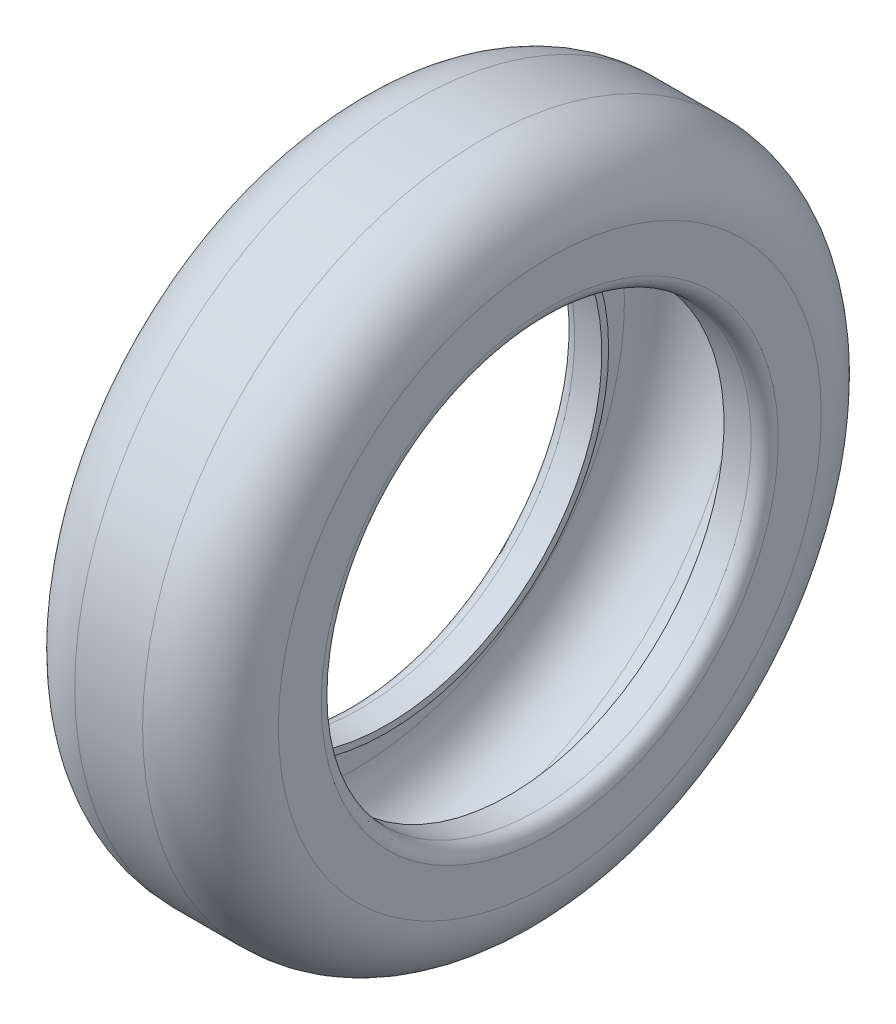
ISO-10303-21;
HEADER;
FILE_DESCRIPTION(('STEP AP214'),'2;1');
FILE_NAME('part.step','',(''),(''),'','','');
FILE_SCHEMA(('AUTOMOTIVE_DESIGN { 1 0 10303 214 1 1 1 1 }'));
ENDSEC;
DATA;
#1=APPLICATION_CONTEXT('core data for automotive mechanical design processes');
#2=APPLICATION_PROTOCOL_DEFINITION('international standard','automotive_design',2000,#1);
#3=PRODUCT_CONTEXT('',#1,'mechanical');
#4=PRODUCT('Part','Part','',(#3));
#5=PRODUCT_RELATED_PRODUCT_CATEGORY('part','',(#4));
#6=PRODUCT_DEFINITION_FORMATION('','',#4);
#7=PRODUCT_DEFINITION_CONTEXT('part definition',#1,'design');
#8=PRODUCT_DEFINITION('design','',#6,#7);
#9=PRODUCT_DEFINITION_SHAPE('','',#8);
#10=(LENGTH_UNIT() NAMED_UNIT(*) SI_UNIT(.MILLI.,.METRE.));
#11=(NAMED_UNIT(*) PLANE_ANGLE_UNIT() SI_UNIT($,.RADIAN.));
#12=(NAMED_UNIT(*) SI_UNIT($,.STERADIAN.) SOLID_ANGLE_UNIT());
#13=UNCERTAINTY_MEASURE_WITH_UNIT(LENGTH_MEASURE(1.E-05),#10,'distance_accuracy_value','');
#14=(GEOMETRIC_REPRESENTATION_CONTEXT(3) GLOBAL_UNCERTAINTY_ASSIGNED_CONTEXT((#13)) GLOBAL_UNIT_ASSIGNED_CONTEXT((#10,
#11,#12)) REPRESENTATION_CONTEXT('',''));
#15=CARTESIAN_POINT('',(0.,0.,0.));
#16=DIRECTION('',(0.,0.,1.));
#17=DIRECTION('',(1.,0.,0.));
#18=AXIS2_PLACEMENT_3D('',#15,#16,#17);
#19=CARTESIAN_POINT('',(-45.,163.348486100883,0.));
#20=DIRECTION('',(-1.,0.,0.));
#21=DIRECTION('',(0.,0.,1.));
#22=AXIS2_PLACEMENT_3D('',#19,#20,#21);
#23=PLANE('',#22);
#24=CARTESIAN_POINT('',(-45.,0.,0.));
#25=DIRECTION('',(-1.,0.,0.));
#26=DIRECTION('',(0.,0.,1.));
#27=AXIS2_PLACEMENT_3D('',#24,#25,#26);
#28=CIRCLE('',#27,163.348486100883);
#29=CARTESIAN_POINT('',(-45.,0.,163.348486100883));
#30=VERTEX_POINT('',#29);
#31=EDGE_CURVE('E99',#30,#30,#28,.T.);
#32=ORIENTED_EDGE('',*,*,#31,.F.);
#33=EDGE_LOOP('',(#32));
#34=FACE_BOUND('',#33,.T.);
#35=CARTESIAN_POINT('',(-45.,0.,0.));
#36=DIRECTION('',(-1.,0.,0.));
#37=DIRECTION('',(0.,0.,1.));
#38=AXIS2_PLACEMENT_3D('',#35,#36,#37);
#39=CIRCLE('',#38,158.348486100883);
#40=CARTESIAN_POINT('',(-45.,0.,158.348486100883));
#41=VERTEX_POINT('',#40);
#42=EDGE_CURVE('E10',#41,#41,#39,.T.);
#43=ORIENTED_EDGE('',*,*,#42,.T.);
#44=EDGE_LOOP('',(#43));
#45=FACE_BOUND('',#44,.T.);
#46=ADVANCED_FACE('F35',(#34,#45),#23,.F.);
#47=CARTESIAN_POINT('',(-45.,0.,0.));
#48=DIRECTION('',(-1.,0.,0.));
#49=DIRECTION('',(0.,0.,1.));
#50=AXIS2_PLACEMENT_3D('',#47,#48,#49);
#51=CYLINDRICAL_SURFACE('',#50,158.348486100883);
#52=ORIENTED_EDGE('',*,*,#42,.F.);
#53=EDGE_LOOP('',(#52));
#54=FACE_BOUND('',#53,.T.);
#55=CARTESIAN_POINT('',(-64.9999999999998,0.,0.));
#56=DIRECTION('',(-1.,0.,0.));
#57=DIRECTION('',(0.,0.,1.));
#58=AXIS2_PLACEMENT_3D('',#55,#56,#57);
#59=CIRCLE('',#58,158.348486100883);
#60=CARTESIAN_POINT('',(-64.9999999999998,0.,158.348486100883));
#61=VERTEX_POINT('',#60);
#62=EDGE_CURVE('E41',#61,#61,#59,.T.);
#63=ORIENTED_EDGE('',*,*,#62,.T.);
#64=EDGE_LOOP('',(#63));
#65=FACE_BOUND('',#64,.T.);
#66=ADVANCED_FACE('F106',(#54,#65),#51,.F.);
#67=CARTESIAN_POINT('',(-64.9999999999998,0.,0.));
#68=DIRECTION('',(-1.,0.,0.));
#69=DIRECTION('',(0.,0.,1.));
#70=AXIS2_PLACEMENT_3D('',#67,#68,#69);
#71=TOROIDAL_SURFACE('',#70,168.348486100883,10.0000000000001);
#72=ORIENTED_EDGE('',*,*,#62,.F.);
#73=EDGE_LOOP('',(#72));
#74=FACE_BOUND('',#73,.T.);
#75=CARTESIAN_POINT('',(-75.,0.,0.));
#76=DIRECTION('',(-1.,0.,0.));
#77=DIRECTION('',(0.,0.,1.));
#78=AXIS2_PLACEMENT_3D('',#75,#76,#77);
#79=CIRCLE('',#78,168.348486100883);
#80=CARTESIAN_POINT('',(-75.,0.,168.348486100883));
#81=VERTEX_POINT('',#80);
#82=EDGE_CURVE('E45',#81,#81,#79,.T.);
#83=ORIENTED_EDGE('',*,*,#82,.T.);
#84=EDGE_LOOP('',(#83));
#85=FACE_BOUND('',#84,.T.);
#86=ADVANCED_FACE('F110',(#74,#85),#71,.T.);
#87=CARTESIAN_POINT('',(-74.9999999999999,168.348486100883,0.));
#88=DIRECTION('',(1.,0.,0.));
#89=DIRECTION('',(0.,0.,-1.));
#90=AXIS2_PLACEMENT_3D('',#87,#88,#89);
#91=PLANE('',#90);
#92=ORIENTED_EDGE('',*,*,#82,.F.);
#93=EDGE_LOOP('',(#92));
#94=FACE_BOUND('',#93,.T.);
#95=CARTESIAN_POINT('',(-74.9999999999997,0.,0.));
#96=DIRECTION('',(-1.,0.,0.));
#97=DIRECTION('',(0.,0.,1.));
#98=AXIS2_PLACEMENT_3D('',#95,#96,#97);
#99=CIRCLE('',#98,200.);
#100=CARTESIAN_POINT('',(-74.9999999999997,0.,200.));
#101=VERTEX_POINT('',#100);
#102=EDGE_CURVE('E49',#101,#101,#99,.T.);
#103=ORIENTED_EDGE('',*,*,#102,.T.);
#104=EDGE_LOOP('',(#103));
#105=FACE_BOUND('',#104,.T.);
#106=ADVANCED_FACE('F115',(#94,#105),#91,.F.);
#107=CARTESIAN_POINT('',(-24.9999999999997,0.,0.));
#108=DIRECTION('',(-1.,0.,0.));
#109=DIRECTION('',(0.,0.,1.));
#110=AXIS2_PLACEMENT_3D('',#107,#108,#109);
#111=TOROIDAL_SURFACE('',#110,200.,50.);
#112=ORIENTED_EDGE('',*,*,#102,.F.);
#113=EDGE_LOOP('',(#112));
#114=FACE_BOUND('',#113,.T.);
#115=CARTESIAN_POINT('',(-24.9999999999997,0.,0.));
#116=DIRECTION('',(-1.,0.,0.));
#117=DIRECTION('',(0.,0.,1.));
#118=AXIS2_PLACEMENT_3D('',#115,#116,#117);
#119=CIRCLE('',#118,250.);
#120=CARTESIAN_POINT('',(-24.9999999999997,0.,250.));
#121=VERTEX_POINT('',#120);
#122=EDGE_CURVE('E54',#121,#121,#119,.T.);
#123=ORIENTED_EDGE('',*,*,#122,.T.);
#124=EDGE_LOOP('',(#123));
#125=FACE_BOUND('',#124,.T.);
#126=ADVANCED_FACE('F121',(#114,#125),#111,.T.);
#127=CARTESIAN_POINT('',(-45.,0.,0.));
#128=DIRECTION('',(-1.,0.,0.));
#129=DIRECTION('',(0.,0.,1.));
#130=AXIS2_PLACEMENT_3D('',#127,#128,#129);
#131=CYLINDRICAL_SURFACE('',#130,250.);
#132=ORIENTED_EDGE('',*,*,#122,.F.);
#133=EDGE_LOOP('',(#132));
#134=FACE_BOUND('',#133,.T.);
#135=CARTESIAN_POINT('',(25.0000000000001,0.,0.));
#136=DIRECTION('',(-1.,0.,0.));
#137=DIRECTION('',(0.,0.,1.));
#138=AXIS2_PLACEMENT_3D('',#135,#136,#137);
#139=CIRCLE('',#138,250.);
#140=CARTESIAN_POINT('',(25.0000000000001,0.,250.));
#141=VERTEX_POINT('',#140);
#142=EDGE_CURVE('E57',#141,#141,#139,.T.);
#143=ORIENTED_EDGE('',*,*,#142,.T.);
#144=EDGE_LOOP('',(#143));
#145=FACE_BOUND('',#144,.T.);
#146=ADVANCED_FACE('F125',(#134,#145),#131,.T.);
#147=CARTESIAN_POINT('',(25.0000000000001,0.,0.));
#148=DIRECTION('',(-1.,0.,0.));
#149=DIRECTION('',(0.,0.,1.));
#150=AXIS2_PLACEMENT_3D('',#147,#148,#149);
#151=TOROIDAL_SURFACE('',#150,200.,50.);
#152=ORIENTED_EDGE('',*,*,#142,.F.);
#153=EDGE_LOOP('',(#152));
#154=FACE_BOUND('',#153,.T.);
#155=CARTESIAN_POINT('',(75.0000000000001,0.,0.));
#156=DIRECTION('',(-1.,0.,0.));
#157=DIRECTION('',(0.,0.,1.));
#158=AXIS2_PLACEMENT_3D('',#155,#156,#157);
#159=CIRCLE('',#158,200.);
#160=CARTESIAN_POINT('',(75.0000000000001,0.,200.));
#161=VERTEX_POINT('',#160);
#162=EDGE_CURVE('E60',#161,#161,#159,.T.);
#163=ORIENTED_EDGE('',*,*,#162,.T.);
#164=EDGE_LOOP('',(#163));
#165=FACE_BOUND('',#164,.T.);
#166=ADVANCED_FACE('F129',(#154,#165),#151,.T.);
#167=CARTESIAN_POINT('',(75.,200.,0.));
#168=DIRECTION('',(-1.,0.,0.));
#169=DIRECTION('',(0.,0.,1.));
#170=AXIS2_PLACEMENT_3D('',#167,#168,#169);
#171=PLANE('',#170);
#172=ORIENTED_EDGE('',*,*,#162,.F.);
#173=EDGE_LOOP('',(#172));
#174=FACE_BOUND('',#173,.T.);
#175=CARTESIAN_POINT('',(75.,0.,0.));
#176=DIRECTION('',(-1.,0.,0.));
#177=DIRECTION('',(0.,0.,1.));
#178=AXIS2_PLACEMENT_3D('',#175,#176,#177);
#179=CIRCLE('',#178,168.348486100883);
#180=CARTESIAN_POINT('',(75.,0.,168.348486100883));
#181=VERTEX_POINT('',#180);
#182=EDGE_CURVE('E63',#181,#181,#179,.T.);
#183=ORIENTED_EDGE('',*,*,#182,.T.);
#184=EDGE_LOOP('',(#183));
#185=FACE_BOUND('',#184,.T.);
#186=ADVANCED_FACE('F133',(#174,#185),#171,.F.);
#187=CARTESIAN_POINT('',(65.,0.,0.));
#188=DIRECTION('',(-1.,0.,0.));
#189=DIRECTION('',(0.,0.,1.));
#190=AXIS2_PLACEMENT_3D('',#187,#188,#189);
#191=TOROIDAL_SURFACE('',#190,168.348486100883,9.99999999999999);
#192=ORIENTED_EDGE('',*,*,#182,.F.);
#193=EDGE_LOOP('',(#192));
#194=FACE_BOUND('',#193,.T.);
#195=CARTESIAN_POINT('',(65.,0.,0.));
#196=DIRECTION('',(-1.,0.,0.));
#197=DIRECTION('',(0.,0.,1.));
#198=AXIS2_PLACEMENT_3D('',#195,#196,#197);
#199=CIRCLE('',#198,158.348486100883);
#200=CARTESIAN_POINT('',(65.,0.,158.348486100883));
#201=VERTEX_POINT('',#200);
#202=EDGE_CURVE('E66',#201,#201,#199,.T.);
#203=ORIENTED_EDGE('',*,*,#202,.T.);
#204=EDGE_LOOP('',(#203));
#205=FACE_BOUND('',#204,.T.);
#206=ADVANCED_FACE('F137',(#194,#205),#191,.T.);
#207=CARTESIAN_POINT('',(-45.,0.,0.));
#208=DIRECTION('',(-1.,0.,0.));
#209=DIRECTION('',(0.,0.,1.));
#210=AXIS2_PLACEMENT_3D('',#207,#208,#209);
#211=CYLINDRICAL_SURFACE('',#210,158.348486100883);
#212=ORIENTED_EDGE('',*,*,#202,.F.);
#213=EDGE_LOOP('',(#212));
#214=FACE_BOUND('',#213,.T.);
#215=CARTESIAN_POINT('',(45.,0.,0.));
#216=DIRECTION('',(-1.,0.,0.));
#217=DIRECTION('',(0.,0.,1.));
#218=AXIS2_PLACEMENT_3D('',#215,#216,#217);
#219=CIRCLE('',#218,158.348486100883);
#220=CARTESIAN_POINT('',(45.,0.,158.348486100883));
#221=VERTEX_POINT('',#220);
#222=EDGE_CURVE('E69',#221,#221,#219,.T.);
#223=ORIENTED_EDGE('',*,*,#222,.T.);
#224=EDGE_LOOP('',(#223));
#225=FACE_BOUND('',#224,.T.);
#226=ADVANCED_FACE('F141',(#214,#225),#211,.F.);
#227=CARTESIAN_POINT('',(45.,163.348486100883,0.));
#228=DIRECTION('',(1.,0.,0.));
#229=DIRECTION('',(0.,0.,-1.));
#230=AXIS2_PLACEMENT_3D('',#227,#228,#229);
#231=PLANE('',#230);
#232=ORIENTED_EDGE('',*,*,#222,.F.);
#233=EDGE_LOOP('',(#232));
#234=FACE_BOUND('',#233,.T.);
#235=CARTESIAN_POINT('',(45.,0.,0.));
#236=DIRECTION('',(-1.,0.,0.));
#237=DIRECTION('',(0.,0.,1.));
#238=AXIS2_PLACEMENT_3D('',#235,#236,#237);
#239=CIRCLE('',#238,163.348486100883);
#240=CARTESIAN_POINT('',(45.,0.,163.348486100883));
#241=VERTEX_POINT('',#240);
#242=EDGE_CURVE('E72',#241,#241,#239,.T.);
#243=ORIENTED_EDGE('',*,*,#242,.T.);
#244=EDGE_LOOP('',(#243));
#245=FACE_BOUND('',#244,.T.);
#246=ADVANCED_FACE('F145',(#234,#245),#231,.F.);
#247=CARTESIAN_POINT('',(-45.,0.,0.));
#248=DIRECTION('',(-1.,0.,0.));
#249=DIRECTION('',(0.,0.,1.));
#250=AXIS2_PLACEMENT_3D('',#247,#248,#249);
#251=CYLINDRICAL_SURFACE('',#250,163.348486100883);
#252=ORIENTED_EDGE('',*,*,#242,.F.);
#253=EDGE_LOOP('',(#252));
#254=FACE_BOUND('',#253,.T.);
#255=CARTESIAN_POINT('',(65.,0.,0.));
#256=DIRECTION('',(-1.,0.,0.));
#257=DIRECTION('',(0.,0.,1.));
#258=AXIS2_PLACEMENT_3D('',#255,#256,#257);
#259=CIRCLE('',#258,163.348486100883);
#260=CARTESIAN_POINT('',(65.,0.,163.348486100883));
#261=VERTEX_POINT('',#260);
#262=EDGE_CURVE('E75',#261,#261,#259,.T.);
#263=ORIENTED_EDGE('',*,*,#262,.T.);
#264=EDGE_LOOP('',(#263));
#265=FACE_BOUND('',#264,.T.);
#266=ADVANCED_FACE('F149',(#254,#265),#251,.T.);
#267=CARTESIAN_POINT('',(65.,0.,0.));
#268=DIRECTION('',(-1.,0.,0.));
#269=DIRECTION('',(0.,0.,1.));
#270=AXIS2_PLACEMENT_3D('',#267,#268,#269);
#271=TOROIDAL_SURFACE('',#270,168.348486100883,5.00000000000003);
#272=ORIENTED_EDGE('',*,*,#262,.F.);
#273=EDGE_LOOP('',(#272));
#274=FACE_BOUND('',#273,.T.);
#275=CARTESIAN_POINT('',(70.0000000000001,0.,0.));
#276=DIRECTION('',(-1.,0.,0.));
#277=DIRECTION('',(0.,0.,1.));
#278=AXIS2_PLACEMENT_3D('',#275,#276,#277);
#279=CIRCLE('',#278,168.348486100883);
#280=CARTESIAN_POINT('',(70.0000000000001,0.,168.348486100883));
#281=VERTEX_POINT('',#280);
#282=EDGE_CURVE('E78',#281,#281,#279,.T.);
#283=ORIENTED_EDGE('',*,*,#282,.T.);
#284=EDGE_LOOP('',(#283));
#285=FACE_BOUND('',#284,.T.);
#286=ADVANCED_FACE('F153',(#274,#285),#271,.F.);
#287=CARTESIAN_POINT('',(70.0000000000001,200.,0.));
#288=DIRECTION('',(1.,0.,0.));
#289=DIRECTION('',(0.,0.,-1.));
#290=AXIS2_PLACEMENT_3D('',#287,#288,#289);
#291=PLANE('',#290);
#292=ORIENTED_EDGE('',*,*,#282,.F.);
#293=EDGE_LOOP('',(#292));
#294=FACE_BOUND('',#293,.T.);
#295=CARTESIAN_POINT('',(70.0000000000001,0.,0.));
#296=DIRECTION('',(-1.,0.,0.));
#297=DIRECTION('',(0.,0.,1.));
#298=AXIS2_PLACEMENT_3D('',#295,#296,#297);
#299=CIRCLE('',#298,200.);
#300=CARTESIAN_POINT('',(70.0000000000001,0.,200.));
#301=VERTEX_POINT('',#300);
#302=EDGE_CURVE('E81',#301,#301,#299,.T.);
#303=ORIENTED_EDGE('',*,*,#302,.T.);
#304=EDGE_LOOP('',(#303));
#305=FACE_BOUND('',#304,.T.);
#306=ADVANCED_FACE('F157',(#294,#305),#291,.F.);
#307=CARTESIAN_POINT('',(25.0000000000001,0.,0.));
#308=DIRECTION('',(-1.,0.,0.));
#309=DIRECTION('',(0.,0.,1.));
#310=AXIS2_PLACEMENT_3D('',#307,#308,#309);
#311=TOROIDAL_SURFACE('',#310,200.,45.);
#312=ORIENTED_EDGE('',*,*,#302,.F.);
#313=EDGE_LOOP('',(#312));
#314=FACE_BOUND('',#313,.T.);
#315=CARTESIAN_POINT('',(25.0000000000001,0.,0.));
#316=DIRECTION('',(-1.,0.,0.));
#317=DIRECTION('',(0.,0.,1.));
#318=AXIS2_PLACEMENT_3D('',#315,#316,#317);
#319=CIRCLE('',#318,245.);
#320=CARTESIAN_POINT('',(25.0000000000001,0.,245.));
#321=VERTEX_POINT('',#320);
#322=EDGE_CURVE('E84',#321,#321,#319,.T.);
#323=ORIENTED_EDGE('',*,*,#322,.T.);
#324=EDGE_LOOP('',(#323));
#325=FACE_BOUND('',#324,.T.);
#326=ADVANCED_FACE('F161',(#314,#325),#311,.F.);
#327=CARTESIAN_POINT('',(-45.,0.,0.));
#328=DIRECTION('',(-1.,0.,0.));
#329=DIRECTION('',(0.,0.,1.));
#330=AXIS2_PLACEMENT_3D('',#327,#328,#329);
#331=CYLINDRICAL_SURFACE('',#330,245.);
#332=ORIENTED_EDGE('',*,*,#322,.F.);
#333=EDGE_LOOP('',(#332));
#334=FACE_BOUND('',#333,.T.);
#335=CARTESIAN_POINT('',(-24.9999999999997,0.,0.));
#336=DIRECTION('',(-1.,0.,0.));
#337=DIRECTION('',(0.,0.,1.));
#338=AXIS2_PLACEMENT_3D('',#335,#336,#337);
#339=CIRCLE('',#338,245.);
#340=CARTESIAN_POINT('',(-24.9999999999997,0.,245.));
#341=VERTEX_POINT('',#340);
#342=EDGE_CURVE('E87',#341,#341,#339,.T.);
#343=ORIENTED_EDGE('',*,*,#342,.T.);
#344=EDGE_LOOP('',(#343));
#345=FACE_BOUND('',#344,.T.);
#346=ADVANCED_FACE('F165',(#334,#345),#331,.F.);
#347=CARTESIAN_POINT('',(-24.9999999999997,0.,0.));
#348=DIRECTION('',(-1.,0.,0.));
#349=DIRECTION('',(0.,0.,1.));
#350=AXIS2_PLACEMENT_3D('',#347,#348,#349);
#351=TOROIDAL_SURFACE('',#350,200.,45.0000000000001);
#352=ORIENTED_EDGE('',*,*,#342,.F.);
#353=EDGE_LOOP('',(#352));
#354=FACE_BOUND('',#353,.T.);
#355=CARTESIAN_POINT('',(-70.,0.,0.));
#356=DIRECTION('',(-1.,0.,0.));
#357=DIRECTION('',(0.,0.,1.));
#358=AXIS2_PLACEMENT_3D('',#355,#356,#357);
#359=CIRCLE('',#358,200.);
#360=CARTESIAN_POINT('',(-70.,0.,200.));
#361=VERTEX_POINT('',#360);
#362=EDGE_CURVE('E90',#361,#361,#359,.T.);
#363=ORIENTED_EDGE('',*,*,#362,.T.);
#364=EDGE_LOOP('',(#363));
#365=FACE_BOUND('',#364,.T.);
#366=ADVANCED_FACE('F169',(#354,#365),#351,.F.);
#367=CARTESIAN_POINT('',(-69.9999999999999,168.348486100883,0.));
#368=DIRECTION('',(-1.,0.,0.));
#369=DIRECTION('',(0.,0.,1.));
#370=AXIS2_PLACEMENT_3D('',#367,#368,#369);
#371=PLANE('',#370);
#372=ORIENTED_EDGE('',*,*,#362,.F.);
#373=EDGE_LOOP('',(#372));
#374=FACE_BOUND('',#373,.T.);
#375=CARTESIAN_POINT('',(-69.9999999999998,0.,0.));
#376=DIRECTION('',(-1.,0.,0.));
#377=DIRECTION('',(0.,0.,1.));
#378=AXIS2_PLACEMENT_3D('',#375,#376,#377);
#379=CIRCLE('',#378,168.348486100883);
#380=CARTESIAN_POINT('',(-69.9999999999998,0.,168.348486100883));
#381=VERTEX_POINT('',#380);
#382=EDGE_CURVE('E93',#381,#381,#379,.T.);
#383=ORIENTED_EDGE('',*,*,#382,.T.);
#384=EDGE_LOOP('',(#383));
#385=FACE_BOUND('',#384,.T.);
#386=ADVANCED_FACE('F173',(#374,#385),#371,.F.);
#387=CARTESIAN_POINT('',(-64.9999999999998,0.,0.));
#388=DIRECTION('',(-1.,0.,0.));
#389=DIRECTION('',(0.,0.,1.));
#390=AXIS2_PLACEMENT_3D('',#387,#388,#389);
#391=TOROIDAL_SURFACE('',#390,168.348486100883,5.00000000000002);
#392=ORIENTED_EDGE('',*,*,#382,.F.);
#393=EDGE_LOOP('',(#392));
#394=FACE_BOUND('',#393,.T.);
#395=CARTESIAN_POINT('',(-64.9999999999998,0.,0.));
#396=DIRECTION('',(-1.,0.,0.));
#397=DIRECTION('',(0.,0.,1.));
#398=AXIS2_PLACEMENT_3D('',#395,#396,#397);
#399=CIRCLE('',#398,163.348486100883);
#400=CARTESIAN_POINT('',(-64.9999999999998,0.,163.348486100883));
#401=VERTEX_POINT('',#400);
#402=EDGE_CURVE('E96',#401,#401,#399,.T.);
#403=ORIENTED_EDGE('',*,*,#402,.T.);
#404=EDGE_LOOP('',(#403));
#405=FACE_BOUND('',#404,.T.);
#406=ADVANCED_FACE('F177',(#394,#405),#391,.F.);
#407=CARTESIAN_POINT('',(-45.,0.,0.));
#408=DIRECTION('',(-1.,0.,0.));
#409=DIRECTION('',(0.,0.,1.));
#410=AXIS2_PLACEMENT_3D('',#407,#408,#409);
#411=CYLINDRICAL_SURFACE('',#410,163.348486100883);
#412=ORIENTED_EDGE('',*,*,#402,.F.);
#413=EDGE_LOOP('',(#412));
#414=FACE_BOUND('',#413,.T.);
#415=ORIENTED_EDGE('',*,*,#31,.T.);
#416=EDGE_LOOP('',(#415));
#417=FACE_BOUND('',#416,.T.);
#418=ADVANCED_FACE('F103',(#414,#417),#411,.T.);
#419=CLOSED_SHELL('',(#46,#66,#86,#106,#126,#146,#166,#186,#206,#226,#246,#266,#286,#306,#326,
#346,#366,#386,#406,#418));
#420=MANIFOLD_SOLID_BREP('B2',#419);
#421=ADVANCED_BREP_SHAPE_REPRESENTATION('',(#18,#420),#14);
#422=SHAPE_DEFINITION_REPRESENTATION(#9,#421);
ENDSEC;
END-ISO-10303-21;
